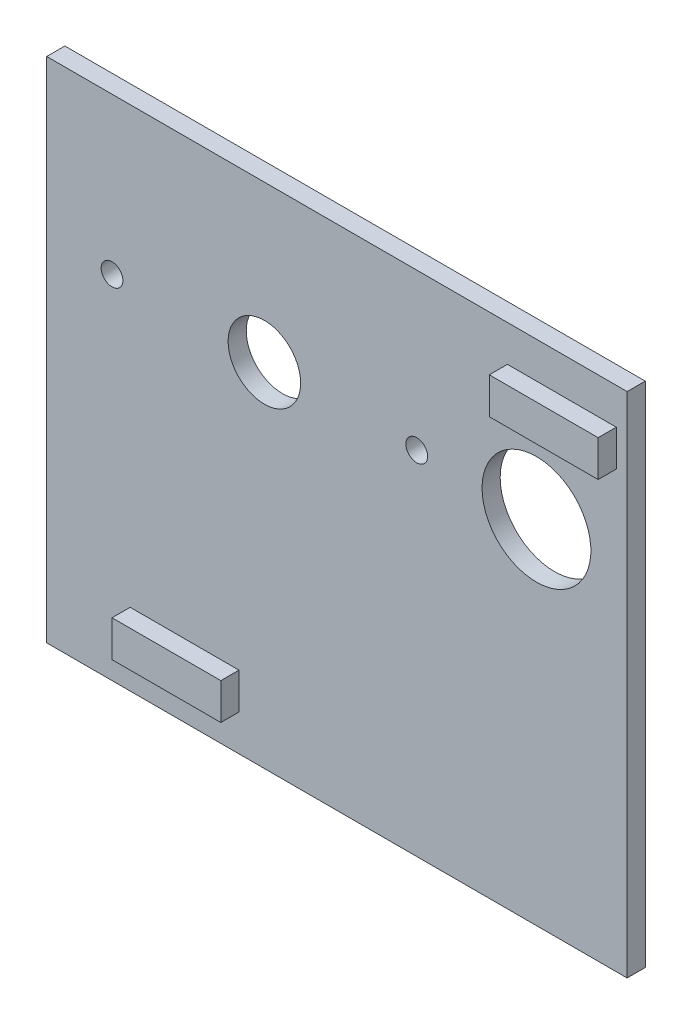
ISO-10303-21;
HEADER;
FILE_DESCRIPTION(('STEP AP214'),'2;1');
FILE_NAME('part.step','',(''),(''),'','','');
FILE_SCHEMA(('AUTOMOTIVE_DESIGN { 1 0 10303 214 1 1 1 1 }'));
ENDSEC;
DATA;
#1=APPLICATION_CONTEXT('core data for automotive mechanical design processes');
#2=APPLICATION_PROTOCOL_DEFINITION('international standard','automotive_design',2000,#1);
#3=PRODUCT_CONTEXT('',#1,'mechanical');
#4=PRODUCT('Part','Part','',(#3));
#5=PRODUCT_RELATED_PRODUCT_CATEGORY('part','',(#4));
#6=PRODUCT_DEFINITION_FORMATION('','',#4);
#7=PRODUCT_DEFINITION_CONTEXT('part definition',#1,'design');
#8=PRODUCT_DEFINITION('design','',#6,#7);
#9=PRODUCT_DEFINITION_SHAPE('','',#8);
#10=(LENGTH_UNIT() NAMED_UNIT(*) SI_UNIT(.MILLI.,.METRE.));
#11=(NAMED_UNIT(*) PLANE_ANGLE_UNIT() SI_UNIT($,.RADIAN.));
#12=(NAMED_UNIT(*) SI_UNIT($,.STERADIAN.) SOLID_ANGLE_UNIT());
#13=UNCERTAINTY_MEASURE_WITH_UNIT(LENGTH_MEASURE(1.E-05),#10,'distance_accuracy_value','');
#14=(GEOMETRIC_REPRESENTATION_CONTEXT(3) GLOBAL_UNCERTAINTY_ASSIGNED_CONTEXT((#13)) GLOBAL_UNIT_ASSIGNED_CONTEXT((#10,
#11,#12)) REPRESENTATION_CONTEXT('',''));
#15=CARTESIAN_POINT('',(0.,0.,0.));
#16=DIRECTION('',(0.,0.,1.));
#17=DIRECTION('',(1.,0.,0.));
#18=AXIS2_PLACEMENT_3D('',#15,#16,#17);
#19=CARTESIAN_POINT('',(0.,0.,5.));
#20=DIRECTION('',(0.,0.,-1.));
#21=DIRECTION('',(-1.,0.,0.));
#22=AXIS2_PLACEMENT_3D('',#19,#20,#21);
#23=PLANE('',#22);
#24=CARTESIAN_POINT('',(-142.,-43.,5.));
#25=DIRECTION('',(0.,0.,-1.));
#26=DIRECTION('',(-1.,0.,0.));
#27=AXIS2_PLACEMENT_3D('',#24,#25,#26);
#28=CIRCLE('',#27,2.99999999999999);
#29=CARTESIAN_POINT('',(-145.,-43.,5.));
#30=VERTEX_POINT('',#29);
#31=EDGE_CURVE('E231',#30,#30,#28,.T.);
#32=ORIENTED_EDGE('',*,*,#31,.T.);
#33=EDGE_LOOP('',(#32));
#34=FACE_BOUND('',#33,.T.);
#35=CARTESIAN_POINT('',(-100.,-43.,5.));
#36=DIRECTION('',(0.,0.,-1.));
#37=DIRECTION('',(-1.,0.,0.));
#38=AXIS2_PLACEMENT_3D('',#35,#36,#37);
#39=CIRCLE('',#38,9.99999999999999);
#40=CARTESIAN_POINT('',(-110.,-43.,5.));
#41=VERTEX_POINT('',#40);
#42=EDGE_CURVE('E220',#41,#41,#39,.T.);
#43=ORIENTED_EDGE('',*,*,#42,.T.);
#44=EDGE_LOOP('',(#43));
#45=FACE_BOUND('',#44,.T.);
#46=CARTESIAN_POINT('',(-58.,-43.,5.));
#47=DIRECTION('',(0.,0.,-1.));
#48=DIRECTION('',(-1.,0.,0.));
#49=AXIS2_PLACEMENT_3D('',#46,#47,#48);
#50=CIRCLE('',#49,3.);
#51=CARTESIAN_POINT('',(-61.,-43.,5.));
#52=VERTEX_POINT('',#51);
#53=EDGE_CURVE('E217',#52,#52,#50,.T.);
#54=ORIENTED_EDGE('',*,*,#53,.T.);
#55=EDGE_LOOP('',(#54));
#56=FACE_BOUND('',#55,.T.);
#57=CARTESIAN_POINT('',(-25.,-43.,5.));
#58=DIRECTION('',(0.,0.,-1.));
#59=DIRECTION('',(-1.,0.,0.));
#60=AXIS2_PLACEMENT_3D('',#57,#58,#59);
#61=CIRCLE('',#60,15.);
#62=CARTESIAN_POINT('',(-40.,-43.,5.));
#63=VERTEX_POINT('',#62);
#64=EDGE_CURVE('E214',#63,#63,#61,.T.);
#65=ORIENTED_EDGE('',*,*,#64,.T.);
#66=EDGE_LOOP('',(#65));
#67=FACE_BOUND('',#66,.T.);
#68=DIRECTION('',(0.,-1.,0.));
#69=VECTOR('',#68,1.);
#70=CARTESIAN_POINT('',(-33.,-9.99999999999999,5.));
#71=LINE('',#70,#69);
#72=CARTESIAN_POINT('',(-33.,-9.99999999999999,5.));
#73=VERTEX_POINT('',#72);
#74=CARTESIAN_POINT('',(-33.,-20.,5.));
#75=VERTEX_POINT('',#74);
#76=EDGE_CURVE('E147',#73,#75,#71,.T.);
#77=ORIENTED_EDGE('',*,*,#76,.F.);
#78=DIRECTION('',(-1.,0.,0.));
#79=VECTOR('',#78,1.);
#80=CARTESIAN_POINT('',(-33.,-9.99999999999999,5.));
#81=LINE('',#80,#79);
#82=CARTESIAN_POINT('',(-2.99999999999998,-10.,5.));
#83=VERTEX_POINT('',#82);
#84=EDGE_CURVE('E160',#83,#73,#81,.T.);
#85=ORIENTED_EDGE('',*,*,#84,.F.);
#86=DIRECTION('',(0.,1.,0.));
#87=VECTOR('',#86,1.);
#88=CARTESIAN_POINT('',(-2.99999999999998,-10.,5.));
#89=LINE('',#88,#87);
#90=CARTESIAN_POINT('',(-2.99999999999999,-20.,5.));
#91=VERTEX_POINT('',#90);
#92=EDGE_CURVE('E169',#91,#83,#89,.T.);
#93=ORIENTED_EDGE('',*,*,#92,.F.);
#94=DIRECTION('',(1.,0.,0.));
#95=VECTOR('',#94,1.);
#96=CARTESIAN_POINT('',(-33.,-20.,5.));
#97=LINE('',#96,#95);
#98=EDGE_CURVE('E150',#75,#91,#97,.T.);
#99=ORIENTED_EDGE('',*,*,#98,.F.);
#100=EDGE_LOOP('',(#77,#85,#93,#99));
#101=FACE_BOUND('',#100,.T.);
#102=DIRECTION('',(0.,1.,0.));
#103=VECTOR('',#102,1.);
#104=CARTESIAN_POINT('',(0.,0.,5.));
#105=LINE('',#104,#103);
#106=CARTESIAN_POINT('',(0.,-140.,5.));
#107=VERTEX_POINT('',#106);
#108=CARTESIAN_POINT('',(0.,0.,5.));
#109=VERTEX_POINT('',#108);
#110=EDGE_CURVE('E186',#107,#109,#105,.T.);
#111=ORIENTED_EDGE('',*,*,#110,.T.);
#112=DIRECTION('',(-1.,0.,0.));
#113=VECTOR('',#112,1.);
#114=CARTESIAN_POINT('',(0.,0.,5.));
#115=LINE('',#114,#113);
#116=CARTESIAN_POINT('',(-160.,0.,5.));
#117=VERTEX_POINT('',#116);
#118=EDGE_CURVE('E189',#109,#117,#115,.T.);
#119=ORIENTED_EDGE('',*,*,#118,.T.);
#120=DIRECTION('',(0.,-1.,0.));
#121=VECTOR('',#120,1.);
#122=CARTESIAN_POINT('',(-160.,0.,5.));
#123=LINE('',#122,#121);
#124=CARTESIAN_POINT('',(-160.,-140.,5.));
#125=VERTEX_POINT('',#124);
#126=EDGE_CURVE('E192',#117,#125,#123,.T.);
#127=ORIENTED_EDGE('',*,*,#126,.T.);
#128=DIRECTION('',(1.,0.,0.));
#129=VECTOR('',#128,1.);
#130=CARTESIAN_POINT('',(0.,-140.,5.));
#131=LINE('',#130,#129);
#132=EDGE_CURVE('E194',#125,#107,#131,.T.);
#133=ORIENTED_EDGE('',*,*,#132,.T.);
#134=EDGE_LOOP('',(#111,#119,#127,#133));
#135=FACE_BOUND('',#134,.T.);
#136=DIRECTION('',(0.,-1.,0.));
#137=VECTOR('',#136,1.);
#138=CARTESIAN_POINT('',(-137.,-120.,5.));
#139=LINE('',#138,#137);
#140=CARTESIAN_POINT('',(-137.,-120.,5.));
#141=VERTEX_POINT('',#140);
#142=CARTESIAN_POINT('',(-137.,-130.,5.));
#143=VERTEX_POINT('',#142);
#144=EDGE_CURVE('E146',#141,#143,#139,.T.);
#145=ORIENTED_EDGE('',*,*,#144,.F.);
#146=DIRECTION('',(-1.,0.,0.));
#147=VECTOR('',#146,1.);
#148=CARTESIAN_POINT('',(-137.,-120.,5.));
#149=LINE('',#148,#147);
#150=CARTESIAN_POINT('',(-107.,-120.,5.));
#151=VERTEX_POINT('',#150);
#152=EDGE_CURVE('E143',#151,#141,#149,.T.);
#153=ORIENTED_EDGE('',*,*,#152,.F.);
#154=DIRECTION('',(0.,1.,0.));
#155=VECTOR('',#154,1.);
#156=CARTESIAN_POINT('',(-107.,-120.,5.));
#157=LINE('',#156,#155);
#158=CARTESIAN_POINT('',(-107.,-130.,5.));
#159=VERTEX_POINT('',#158);
#160=EDGE_CURVE('E57',#159,#151,#157,.T.);
#161=ORIENTED_EDGE('',*,*,#160,.F.);
#162=DIRECTION('',(1.,0.,0.));
#163=VECTOR('',#162,1.);
#164=CARTESIAN_POINT('',(-137.,-130.,5.));
#165=LINE('',#164,#163);
#166=EDGE_CURVE('E52',#143,#159,#165,.T.);
#167=ORIENTED_EDGE('',*,*,#166,.F.);
#168=EDGE_LOOP('',(#145,#153,#161,#167));
#169=FACE_BOUND('',#168,.T.);
#170=ADVANCED_FACE('F35',(#34,#45,#56,#67,#101,#135,#169),#23,.F.);
#171=CARTESIAN_POINT('',(0.,0.,5.));
#172=DIRECTION('',(-1.,0.,0.));
#173=DIRECTION('',(0.,-1.,0.));
#174=AXIS2_PLACEMENT_3D('',#171,#172,#173);
#175=PLANE('',#174);
#176=DIRECTION('',(0.,1.,0.));
#177=VECTOR('',#176,1.);
#178=CARTESIAN_POINT('',(0.,0.,0.));
#179=LINE('',#178,#177);
#180=CARTESIAN_POINT('',(0.,-140.,0.));
#181=VERTEX_POINT('',#180);
#182=CARTESIAN_POINT('',(0.,0.,0.));
#183=VERTEX_POINT('',#182);
#184=EDGE_CURVE('E185',#181,#183,#179,.T.);
#185=ORIENTED_EDGE('',*,*,#184,.T.);
#186=DIRECTION('',(0.,0.,-1.));
#187=VECTOR('',#186,1.);
#188=CARTESIAN_POINT('',(0.,0.,5.));
#189=LINE('',#188,#187);
#190=EDGE_CURVE('E11',#109,#183,#189,.T.);
#191=ORIENTED_EDGE('',*,*,#190,.F.);
#192=ORIENTED_EDGE('',*,*,#110,.F.);
#193=DIRECTION('',(0.,0.,-1.));
#194=VECTOR('',#193,1.);
#195=CARTESIAN_POINT('',(0.,-140.,5.));
#196=LINE('',#195,#194);
#197=EDGE_CURVE('E196',#107,#181,#196,.T.);
#198=ORIENTED_EDGE('',*,*,#197,.T.);
#199=EDGE_LOOP('',(#185,#191,#192,#198));
#200=FACE_BOUND('',#199,.T.);
#201=ADVANCED_FACE('F37',(#200),#175,.F.);
#202=CARTESIAN_POINT('',(0.,0.,5.));
#203=DIRECTION('',(0.,-1.,0.));
#204=DIRECTION('',(1.,0.,0.));
#205=AXIS2_PLACEMENT_3D('',#202,#203,#204);
#206=PLANE('',#205);
#207=DIRECTION('',(-1.,0.,0.));
#208=VECTOR('',#207,1.);
#209=CARTESIAN_POINT('',(0.,0.,0.));
#210=LINE('',#209,#208);
#211=CARTESIAN_POINT('',(-160.,0.,0.));
#212=VERTEX_POINT('',#211);
#213=EDGE_CURVE('E199',#183,#212,#210,.T.);
#214=ORIENTED_EDGE('',*,*,#213,.T.);
#215=DIRECTION('',(0.,0.,-1.));
#216=VECTOR('',#215,1.);
#217=CARTESIAN_POINT('',(-160.,0.,5.));
#218=LINE('',#217,#216);
#219=EDGE_CURVE('E44',#117,#212,#218,.T.);
#220=ORIENTED_EDGE('',*,*,#219,.F.);
#221=ORIENTED_EDGE('',*,*,#118,.F.);
#222=ORIENTED_EDGE('',*,*,#190,.T.);
#223=EDGE_LOOP('',(#214,#220,#221,#222));
#224=FACE_BOUND('',#223,.T.);
#225=ADVANCED_FACE('F262',(#224),#206,.F.);
#226=CARTESIAN_POINT('',(-160.,0.,5.));
#227=DIRECTION('',(1.,0.,0.));
#228=DIRECTION('',(0.,0.,-1.));
#229=AXIS2_PLACEMENT_3D('',#226,#227,#228);
#230=PLANE('',#229);
#231=DIRECTION('',(0.,-1.,0.));
#232=VECTOR('',#231,1.);
#233=CARTESIAN_POINT('',(-160.,0.,0.));
#234=LINE('',#233,#232);
#235=CARTESIAN_POINT('',(-160.,-140.,0.));
#236=VERTEX_POINT('',#235);
#237=EDGE_CURVE('E201',#212,#236,#234,.T.);
#238=ORIENTED_EDGE('',*,*,#237,.T.);
#239=DIRECTION('',(0.,0.,-1.));
#240=VECTOR('',#239,1.);
#241=CARTESIAN_POINT('',(-160.,-140.,5.));
#242=LINE('',#241,#240);
#243=EDGE_CURVE('E206',#125,#236,#242,.T.);
#244=ORIENTED_EDGE('',*,*,#243,.F.);
#245=ORIENTED_EDGE('',*,*,#126,.F.);
#246=ORIENTED_EDGE('',*,*,#219,.T.);
#247=EDGE_LOOP('',(#238,#244,#245,#246));
#248=FACE_BOUND('',#247,.T.);
#249=ADVANCED_FACE('F276',(#248),#230,.F.);
#250=CARTESIAN_POINT('',(0.,-140.,5.));
#251=DIRECTION('',(0.,1.,0.));
#252=DIRECTION('',(0.,0.,1.));
#253=AXIS2_PLACEMENT_3D('',#250,#251,#252);
#254=PLANE('',#253);
#255=DIRECTION('',(1.,0.,0.));
#256=VECTOR('',#255,1.);
#257=CARTESIAN_POINT('',(0.,-140.,0.));
#258=LINE('',#257,#256);
#259=EDGE_CURVE('E190',#236,#181,#258,.T.);
#260=ORIENTED_EDGE('',*,*,#259,.T.);
#261=ORIENTED_EDGE('',*,*,#197,.F.);
#262=ORIENTED_EDGE('',*,*,#132,.F.);
#263=ORIENTED_EDGE('',*,*,#243,.T.);
#264=EDGE_LOOP('',(#260,#261,#262,#263));
#265=FACE_BOUND('',#264,.T.);
#266=ADVANCED_FACE('F272',(#265),#254,.F.);
#267=CARTESIAN_POINT('',(0.,0.,0.));
#268=DIRECTION('',(0.,0.,-1.));
#269=DIRECTION('',(-1.,0.,0.));
#270=AXIS2_PLACEMENT_3D('',#267,#268,#269);
#271=PLANE('',#270);
#272=CARTESIAN_POINT('',(-142.,-43.,0.));
#273=DIRECTION('',(0.,0.,-1.));
#274=DIRECTION('',(-1.,0.,0.));
#275=AXIS2_PLACEMENT_3D('',#272,#273,#274);
#276=CIRCLE('',#275,2.99999999999999);
#277=CARTESIAN_POINT('',(-145.,-43.,0.));
#278=VERTEX_POINT('',#277);
#279=EDGE_CURVE('E39',#278,#278,#276,.T.);
#280=ORIENTED_EDGE('',*,*,#279,.F.);
#281=EDGE_LOOP('',(#280));
#282=FACE_BOUND('',#281,.T.);
#283=CARTESIAN_POINT('',(-100.,-43.,0.));
#284=DIRECTION('',(0.,0.,-1.));
#285=DIRECTION('',(-1.,0.,0.));
#286=AXIS2_PLACEMENT_3D('',#283,#284,#285);
#287=CIRCLE('',#286,9.99999999999999);
#288=CARTESIAN_POINT('',(-110.,-43.,0.));
#289=VERTEX_POINT('',#288);
#290=EDGE_CURVE('E218',#289,#289,#287,.T.);
#291=ORIENTED_EDGE('',*,*,#290,.F.);
#292=EDGE_LOOP('',(#291));
#293=FACE_BOUND('',#292,.T.);
#294=CARTESIAN_POINT('',(-58.,-43.,0.));
#295=DIRECTION('',(0.,0.,-1.));
#296=DIRECTION('',(-1.,0.,0.));
#297=AXIS2_PLACEMENT_3D('',#294,#295,#296);
#298=CIRCLE('',#297,3.);
#299=CARTESIAN_POINT('',(-61.,-43.,0.));
#300=VERTEX_POINT('',#299);
#301=EDGE_CURVE('E215',#300,#300,#298,.T.);
#302=ORIENTED_EDGE('',*,*,#301,.F.);
#303=EDGE_LOOP('',(#302));
#304=FACE_BOUND('',#303,.T.);
#305=CARTESIAN_POINT('',(-25.,-43.,0.));
#306=DIRECTION('',(0.,0.,-1.));
#307=DIRECTION('',(-1.,0.,0.));
#308=AXIS2_PLACEMENT_3D('',#305,#306,#307);
#309=CIRCLE('',#308,15.);
#310=CARTESIAN_POINT('',(-40.,-43.,0.));
#311=VERTEX_POINT('',#310);
#312=EDGE_CURVE('E211',#311,#311,#309,.T.);
#313=ORIENTED_EDGE('',*,*,#312,.F.);
#314=EDGE_LOOP('',(#313));
#315=FACE_BOUND('',#314,.T.);
#316=ORIENTED_EDGE('',*,*,#184,.F.);
#317=ORIENTED_EDGE('',*,*,#259,.F.);
#318=ORIENTED_EDGE('',*,*,#237,.F.);
#319=ORIENTED_EDGE('',*,*,#213,.F.);
#320=EDGE_LOOP('',(#316,#317,#318,#319));
#321=FACE_BOUND('',#320,.T.);
#322=ADVANCED_FACE('F269',(#282,#293,#304,#315,#321),#271,.T.);
#323=CARTESIAN_POINT('',(-33.,-9.99999999999999,10.));
#324=DIRECTION('',(1.,0.,0.));
#325=DIRECTION('',(0.,1.,0.));
#326=AXIS2_PLACEMENT_3D('',#323,#324,#325);
#327=PLANE('',#326);
#328=ORIENTED_EDGE('',*,*,#76,.T.);
#329=DIRECTION('',(0.,0.,-1.));
#330=VECTOR('',#329,1.);
#331=CARTESIAN_POINT('',(-33.,-20.,10.));
#332=LINE('',#331,#330);
#333=CARTESIAN_POINT('',(-33.,-20.,10.));
#334=VERTEX_POINT('',#333);
#335=EDGE_CURVE('E182',#334,#75,#332,.T.);
#336=ORIENTED_EDGE('',*,*,#335,.F.);
#337=DIRECTION('',(0.,-1.,0.));
#338=VECTOR('',#337,1.);
#339=CARTESIAN_POINT('',(-33.,-9.99999999999999,10.));
#340=LINE('',#339,#338);
#341=CARTESIAN_POINT('',(-33.,-9.99999999999999,10.));
#342=VERTEX_POINT('',#341);
#343=EDGE_CURVE('E156',#342,#334,#340,.T.);
#344=ORIENTED_EDGE('',*,*,#343,.F.);
#345=DIRECTION('',(0.,0.,-1.));
#346=VECTOR('',#345,1.);
#347=CARTESIAN_POINT('',(-33.,-9.99999999999999,10.));
#348=LINE('',#347,#346);
#349=EDGE_CURVE('E165',#342,#73,#348,.T.);
#350=ORIENTED_EDGE('',*,*,#349,.T.);
#351=EDGE_LOOP('',(#328,#336,#344,#350));
#352=FACE_BOUND('',#351,.T.);
#353=ADVANCED_FACE('F267',(#352),#327,.F.);
#354=CARTESIAN_POINT('',(-33.,-20.,10.));
#355=DIRECTION('',(0.,1.,0.));
#356=DIRECTION('',(-1.,0.,0.));
#357=AXIS2_PLACEMENT_3D('',#354,#355,#356);
#358=PLANE('',#357);
#359=ORIENTED_EDGE('',*,*,#98,.T.);
#360=DIRECTION('',(0.,0.,-1.));
#361=VECTOR('',#360,1.);
#362=CARTESIAN_POINT('',(-2.99999999999999,-20.,10.));
#363=LINE('',#362,#361);
#364=CARTESIAN_POINT('',(-2.99999999999999,-20.,10.));
#365=VERTEX_POINT('',#364);
#366=EDGE_CURVE('E179',#365,#91,#363,.T.);
#367=ORIENTED_EDGE('',*,*,#366,.F.);
#368=DIRECTION('',(1.,0.,0.));
#369=VECTOR('',#368,1.);
#370=CARTESIAN_POINT('',(-33.,-20.,10.));
#371=LINE('',#370,#369);
#372=EDGE_CURVE('E159',#334,#365,#371,.T.);
#373=ORIENTED_EDGE('',*,*,#372,.F.);
#374=ORIENTED_EDGE('',*,*,#335,.T.);
#375=EDGE_LOOP('',(#359,#367,#373,#374));
#376=FACE_BOUND('',#375,.T.);
#377=ADVANCED_FACE('F317',(#376),#358,.F.);
#378=CARTESIAN_POINT('',(-2.99999999999998,-10.,10.));
#379=DIRECTION('',(-1.,0.,0.));
#380=DIRECTION('',(0.,-1.,0.));
#381=AXIS2_PLACEMENT_3D('',#378,#379,#380);
#382=PLANE('',#381);
#383=ORIENTED_EDGE('',*,*,#92,.T.);
#384=DIRECTION('',(0.,0.,-1.));
#385=VECTOR('',#384,1.);
#386=CARTESIAN_POINT('',(-2.99999999999998,-10.,10.));
#387=LINE('',#386,#385);
#388=CARTESIAN_POINT('',(-2.99999999999998,-10.,10.));
#389=VERTEX_POINT('',#388);
#390=EDGE_CURVE('E176',#389,#83,#387,.T.);
#391=ORIENTED_EDGE('',*,*,#390,.F.);
#392=DIRECTION('',(0.,1.,0.));
#393=VECTOR('',#392,1.);
#394=CARTESIAN_POINT('',(-2.99999999999998,-10.,10.));
#395=LINE('',#394,#393);
#396=EDGE_CURVE('E162',#365,#389,#395,.T.);
#397=ORIENTED_EDGE('',*,*,#396,.F.);
#398=ORIENTED_EDGE('',*,*,#366,.T.);
#399=EDGE_LOOP('',(#383,#391,#397,#398));
#400=FACE_BOUND('',#399,.T.);
#401=ADVANCED_FACE('F324',(#400),#382,.F.);
#402=CARTESIAN_POINT('',(-33.,-9.99999999999999,10.));
#403=DIRECTION('',(0.,-1.,0.));
#404=DIRECTION('',(1.,0.,0.));
#405=AXIS2_PLACEMENT_3D('',#402,#403,#404);
#406=PLANE('',#405);
#407=ORIENTED_EDGE('',*,*,#84,.T.);
#408=ORIENTED_EDGE('',*,*,#349,.F.);
#409=DIRECTION('',(-1.,0.,0.));
#410=VECTOR('',#409,1.);
#411=CARTESIAN_POINT('',(-33.,-9.99999999999999,10.));
#412=LINE('',#411,#410);
#413=EDGE_CURVE('E164',#389,#342,#412,.T.);
#414=ORIENTED_EDGE('',*,*,#413,.F.);
#415=ORIENTED_EDGE('',*,*,#390,.T.);
#416=EDGE_LOOP('',(#407,#408,#414,#415));
#417=FACE_BOUND('',#416,.T.);
#418=ADVANCED_FACE('F331',(#417),#406,.F.);
#419=CARTESIAN_POINT('',(0.,0.,10.));
#420=DIRECTION('',(0.,0.,1.));
#421=DIRECTION('',(1.,0.,0.));
#422=AXIS2_PLACEMENT_3D('',#419,#420,#421);
#423=PLANE('',#422);
#424=ORIENTED_EDGE('',*,*,#343,.T.);
#425=ORIENTED_EDGE('',*,*,#372,.T.);
#426=ORIENTED_EDGE('',*,*,#396,.T.);
#427=ORIENTED_EDGE('',*,*,#413,.T.);
#428=EDGE_LOOP('',(#424,#425,#426,#427));
#429=FACE_BOUND('',#428,.T.);
#430=ADVANCED_FACE('F339',(#429),#423,.T.);
#431=CARTESIAN_POINT('',(-137.,-120.,10.));
#432=DIRECTION('',(1.,0.,0.));
#433=DIRECTION('',(0.,0.,-1.));
#434=AXIS2_PLACEMENT_3D('',#431,#432,#433);
#435=PLANE('',#434);
#436=ORIENTED_EDGE('',*,*,#144,.T.);
#437=DIRECTION('',(0.,0.,-1.));
#438=VECTOR('',#437,1.);
#439=CARTESIAN_POINT('',(-137.,-130.,10.));
#440=LINE('',#439,#438);
#441=CARTESIAN_POINT('',(-137.,-130.,10.));
#442=VERTEX_POINT('',#441);
#443=EDGE_CURVE('E127',#442,#143,#440,.T.);
#444=ORIENTED_EDGE('',*,*,#443,.F.);
#445=DIRECTION('',(0.,-1.,0.));
#446=VECTOR('',#445,1.);
#447=CARTESIAN_POINT('',(-137.,-120.,10.));
#448=LINE('',#447,#446);
#449=CARTESIAN_POINT('',(-137.,-120.,10.));
#450=VERTEX_POINT('',#449);
#451=EDGE_CURVE('E134',#450,#442,#448,.T.);
#452=ORIENTED_EDGE('',*,*,#451,.F.);
#453=DIRECTION('',(0.,0.,-1.));
#454=VECTOR('',#453,1.);
#455=CARTESIAN_POINT('',(-137.,-120.,10.));
#456=LINE('',#455,#454);
#457=EDGE_CURVE('E236',#450,#141,#456,.T.);
#458=ORIENTED_EDGE('',*,*,#457,.T.);
#459=EDGE_LOOP('',(#436,#444,#452,#458));
#460=FACE_BOUND('',#459,.T.);
#461=ADVANCED_FACE('F145',(#460),#435,.F.);
#462=CARTESIAN_POINT('',(-137.,-130.,10.));
#463=DIRECTION('',(0.,1.,0.));
#464=DIRECTION('',(0.,0.,1.));
#465=AXIS2_PLACEMENT_3D('',#462,#463,#464);
#466=PLANE('',#465);
#467=ORIENTED_EDGE('',*,*,#166,.T.);
#468=DIRECTION('',(0.,0.,-1.));
#469=VECTOR('',#468,1.);
#470=CARTESIAN_POINT('',(-107.,-130.,10.));
#471=LINE('',#470,#469);
#472=CARTESIAN_POINT('',(-107.,-130.,10.));
#473=VERTEX_POINT('',#472);
#474=EDGE_CURVE('E130',#473,#159,#471,.T.);
#475=ORIENTED_EDGE('',*,*,#474,.F.);
#476=DIRECTION('',(1.,0.,0.));
#477=VECTOR('',#476,1.);
#478=CARTESIAN_POINT('',(-137.,-130.,10.));
#479=LINE('',#478,#477);
#480=EDGE_CURVE('E123',#442,#473,#479,.T.);
#481=ORIENTED_EDGE('',*,*,#480,.F.);
#482=ORIENTED_EDGE('',*,*,#443,.T.);
#483=EDGE_LOOP('',(#467,#475,#481,#482));
#484=FACE_BOUND('',#483,.T.);
#485=ADVANCED_FACE('F125',(#484),#466,.F.);
#486=CARTESIAN_POINT('',(-107.,-120.,10.));
#487=DIRECTION('',(-1.,0.,0.));
#488=DIRECTION('',(0.,0.,1.));
#489=AXIS2_PLACEMENT_3D('',#486,#487,#488);
#490=PLANE('',#489);
#491=ORIENTED_EDGE('',*,*,#160,.T.);
#492=DIRECTION('',(0.,0.,-1.));
#493=VECTOR('',#492,1.);
#494=CARTESIAN_POINT('',(-107.,-120.,10.));
#495=LINE('',#494,#493);
#496=CARTESIAN_POINT('',(-107.,-120.,10.));
#497=VERTEX_POINT('',#496);
#498=EDGE_CURVE('E152',#497,#151,#495,.T.);
#499=ORIENTED_EDGE('',*,*,#498,.F.);
#500=DIRECTION('',(0.,1.,0.));
#501=VECTOR('',#500,1.);
#502=CARTESIAN_POINT('',(-107.,-120.,10.));
#503=LINE('',#502,#501);
#504=EDGE_CURVE('E133',#473,#497,#503,.T.);
#505=ORIENTED_EDGE('',*,*,#504,.F.);
#506=ORIENTED_EDGE('',*,*,#474,.T.);
#507=EDGE_LOOP('',(#491,#499,#505,#506));
#508=FACE_BOUND('',#507,.T.);
#509=ADVANCED_FACE('F247',(#508),#490,.F.);
#510=CARTESIAN_POINT('',(-137.,-120.,10.));
#511=DIRECTION('',(0.,-1.,0.));
#512=DIRECTION('',(1.,0.,0.));
#513=AXIS2_PLACEMENT_3D('',#510,#511,#512);
#514=PLANE('',#513);
#515=ORIENTED_EDGE('',*,*,#152,.T.);
#516=ORIENTED_EDGE('',*,*,#457,.F.);
#517=DIRECTION('',(-1.,0.,0.));
#518=VECTOR('',#517,1.);
#519=CARTESIAN_POINT('',(-137.,-120.,10.));
#520=LINE('',#519,#518);
#521=EDGE_CURVE('E139',#497,#450,#520,.T.);
#522=ORIENTED_EDGE('',*,*,#521,.F.);
#523=ORIENTED_EDGE('',*,*,#498,.T.);
#524=EDGE_LOOP('',(#515,#516,#522,#523));
#525=FACE_BOUND('',#524,.T.);
#526=ADVANCED_FACE('F245',(#525),#514,.F.);
#527=CARTESIAN_POINT('',(0.,0.,10.));
#528=DIRECTION('',(0.,0.,1.));
#529=DIRECTION('',(1.,0.,0.));
#530=AXIS2_PLACEMENT_3D('',#527,#528,#529);
#531=PLANE('',#530);
#532=ORIENTED_EDGE('',*,*,#451,.T.);
#533=ORIENTED_EDGE('',*,*,#480,.T.);
#534=ORIENTED_EDGE('',*,*,#504,.T.);
#535=ORIENTED_EDGE('',*,*,#521,.T.);
#536=EDGE_LOOP('',(#532,#533,#534,#535));
#537=FACE_BOUND('',#536,.T.);
#538=ADVANCED_FACE('F137',(#537),#531,.T.);
#539=CARTESIAN_POINT('',(-25.,-43.,-5.));
#540=DIRECTION('',(0.,0.,1.));
#541=DIRECTION('',(1.,0.,0.));
#542=AXIS2_PLACEMENT_3D('',#539,#540,#541);
#543=CYLINDRICAL_SURFACE('',#542,15.);
#544=ORIENTED_EDGE('',*,*,#312,.T.);
#545=EDGE_LOOP('',(#544));
#546=FACE_BOUND('',#545,.T.);
#547=ORIENTED_EDGE('',*,*,#64,.F.);
#548=EDGE_LOOP('',(#547));
#549=FACE_BOUND('',#548,.T.);
#550=ADVANCED_FACE('F376',(#546,#549),#543,.F.);
#551=CARTESIAN_POINT('',(-58.,-43.,-5.));
#552=DIRECTION('',(0.,0.,1.));
#553=DIRECTION('',(1.,0.,0.));
#554=AXIS2_PLACEMENT_3D('',#551,#552,#553);
#555=CYLINDRICAL_SURFACE('',#554,3.);
#556=ORIENTED_EDGE('',*,*,#301,.T.);
#557=EDGE_LOOP('',(#556));
#558=FACE_BOUND('',#557,.T.);
#559=ORIENTED_EDGE('',*,*,#53,.F.);
#560=EDGE_LOOP('',(#559));
#561=FACE_BOUND('',#560,.T.);
#562=ADVANCED_FACE('F413',(#558,#561),#555,.F.);
#563=CARTESIAN_POINT('',(-100.,-43.,-5.));
#564=DIRECTION('',(0.,0.,1.));
#565=DIRECTION('',(1.,0.,0.));
#566=AXIS2_PLACEMENT_3D('',#563,#564,#565);
#567=CYLINDRICAL_SURFACE('',#566,9.99999999999999);
#568=ORIENTED_EDGE('',*,*,#290,.T.);
#569=EDGE_LOOP('',(#568));
#570=FACE_BOUND('',#569,.T.);
#571=ORIENTED_EDGE('',*,*,#42,.F.);
#572=EDGE_LOOP('',(#571));
#573=FACE_BOUND('',#572,.T.);
#574=ADVANCED_FACE('F420',(#570,#573),#567,.F.);
#575=CARTESIAN_POINT('',(-142.,-43.,-5.));
#576=DIRECTION('',(0.,0.,1.));
#577=DIRECTION('',(1.,0.,0.));
#578=AXIS2_PLACEMENT_3D('',#575,#576,#577);
#579=CYLINDRICAL_SURFACE('',#578,2.99999999999999);
#580=ORIENTED_EDGE('',*,*,#279,.T.);
#581=EDGE_LOOP('',(#580));
#582=FACE_BOUND('',#581,.T.);
#583=ORIENTED_EDGE('',*,*,#31,.F.);
#584=EDGE_LOOP('',(#583));
#585=FACE_BOUND('',#584,.T.);
#586=ADVANCED_FACE('F428',(#582,#585),#579,.F.);
#587=CLOSED_SHELL('',(#170,#201,#225,#249,#266,#322,#353,#377,#401,#418,#430,#461,#485,#509,
#526,#538,#550,#562,#574,#586));
#588=MANIFOLD_SOLID_BREP('B2',#587);
#589=ADVANCED_BREP_SHAPE_REPRESENTATION('',(#18,#588),#14);
#590=SHAPE_DEFINITION_REPRESENTATION(#9,#589);
ENDSEC;
END-ISO-10303-21;
